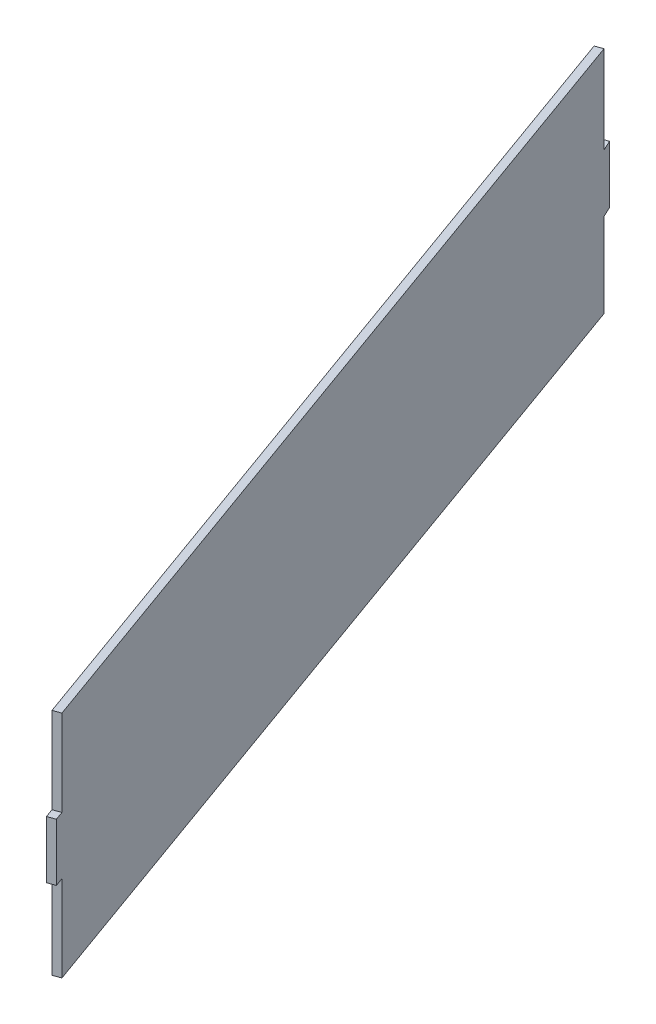
ISO-10303-21;
HEADER;
FILE_DESCRIPTION(('STEP AP214'),'2;1');
FILE_NAME('part.step','',(''),(''),'','','');
FILE_SCHEMA(('AUTOMOTIVE_DESIGN { 1 0 10303 214 1 1 1 1 }'));
ENDSEC;
DATA;
#1=APPLICATION_CONTEXT('core data for automotive mechanical design processes');
#2=APPLICATION_PROTOCOL_DEFINITION('international standard','automotive_design',2000,#1);
#3=PRODUCT_CONTEXT('',#1,'mechanical');
#4=PRODUCT('Part','Part','',(#3));
#5=PRODUCT_RELATED_PRODUCT_CATEGORY('part','',(#4));
#6=PRODUCT_DEFINITION_FORMATION('','',#4);
#7=PRODUCT_DEFINITION_CONTEXT('part definition',#1,'design');
#8=PRODUCT_DEFINITION('design','',#6,#7);
#9=PRODUCT_DEFINITION_SHAPE('','',#8);
#10=(LENGTH_UNIT() NAMED_UNIT(*) SI_UNIT(.MILLI.,.METRE.));
#11=(NAMED_UNIT(*) PLANE_ANGLE_UNIT() SI_UNIT($,.RADIAN.));
#12=(NAMED_UNIT(*) SI_UNIT($,.STERADIAN.) SOLID_ANGLE_UNIT());
#13=UNCERTAINTY_MEASURE_WITH_UNIT(LENGTH_MEASURE(1.E-05),#10,'distance_accuracy_value','');
#14=(GEOMETRIC_REPRESENTATION_CONTEXT(3) GLOBAL_UNCERTAINTY_ASSIGNED_CONTEXT((#13)) GLOBAL_UNIT_ASSIGNED_CONTEXT((#10,
#11,#12)) REPRESENTATION_CONTEXT('',''));
#15=CARTESIAN_POINT('',(0.,0.,0.));
#16=DIRECTION('',(0.,0.,1.));
#17=DIRECTION('',(1.,0.,0.));
#18=AXIS2_PLACEMENT_3D('',#15,#16,#17);
#19=CARTESIAN_POINT('',(237.204386602428,-154.081628831697,2784.44874054199));
#20=DIRECTION('',(0.,1.,0.));
#21=DIRECTION('',(0.,0.,-1.));
#22=AXIS2_PLACEMENT_3D('',#19,#20,#21);
#23=PLANE('',#22);
#24=DIRECTION('',(-0.338341730251732,0.,-0.941023311916482));
#25=VECTOR('',#24,1.);
#26=CARTESIAN_POINT('',(246.7651834515,-154.081628831697,2781.01118856263));
#27=LINE('',#26,#25);
#28=CARTESIAN_POINT('',(250.825284214521,-154.081628831697,2792.30346830563));
#29=VERTEX_POINT('',#28);
#30=CARTESIAN_POINT('',(246.7651834515,-154.081628831697,2781.01118856263));
#31=VERTEX_POINT('',#30);
#32=EDGE_CURVE('E159',#29,#31,#27,.T.);
#33=ORIENTED_EDGE('',*,*,#32,.T.);
#34=DIRECTION('',(0.941023311916483,0.,-0.338341730251728));
#35=VECTOR('',#34,1.);
#36=CARTESIAN_POINT('',(237.204386602428,-154.081628831697,2784.44874054199));
#37=LINE('',#36,#35);
#38=CARTESIAN_POINT('',(237.204386602428,-154.081628831697,2784.44874054199));
#39=VERTEX_POINT('',#38);
#40=EDGE_CURVE('E42',#39,#31,#37,.T.);
#41=ORIENTED_EDGE('',*,*,#40,.F.);
#42=DIRECTION('',(-0.338341730251732,0.,-0.941023311916482));
#43=VECTOR('',#42,1.);
#44=CARTESIAN_POINT('',(237.204386602428,-154.081628831697,2784.44874054199));
#45=LINE('',#44,#43);
#46=CARTESIAN_POINT('',(241.264487365449,-154.081628831697,2795.74102028499));
#47=VERTEX_POINT('',#46);
#48=EDGE_CURVE('E180',#47,#39,#45,.T.);
#49=ORIENTED_EDGE('',*,*,#48,.F.);
#50=DIRECTION('',(0.941023311916483,0.,-0.338341730251728));
#51=VECTOR('',#50,1.);
#52=CARTESIAN_POINT('',(241.264487365449,-154.081628831697,2795.74102028499));
#53=LINE('',#52,#51);
#54=EDGE_CURVE('E11',#47,#29,#53,.T.);
#55=ORIENTED_EDGE('',*,*,#54,.T.);
#56=EDGE_LOOP('',(#33,#41,#49,#55));
#57=FACE_BOUND('',#56,.T.);
#58=ADVANCED_FACE('F39',(#57),#23,.T.);
#59=CARTESIAN_POINT('',(241.264487365449,-154.081628831697,2795.74102028499));
#60=DIRECTION('',(0.338341730251728,0.,0.941023311916483));
#61=DIRECTION('',(-0.941023311916483,0.,0.338341730251728));
#62=AXIS2_PLACEMENT_3D('',#59,#60,#61);
#63=PLANE('',#62);
#64=DIRECTION('',(0.,1.,0.));
#65=VECTOR('',#64,1.);
#66=CARTESIAN_POINT('',(250.825284214521,-154.081628831697,2792.30346830563));
#67=LINE('',#66,#65);
#68=CARTESIAN_POINT('',(250.825284214521,-229.081628831698,2792.30346830563));
#69=VERTEX_POINT('',#68);
#70=EDGE_CURVE('E104',#69,#29,#67,.T.);
#71=ORIENTED_EDGE('',*,*,#70,.T.);
#72=ORIENTED_EDGE('',*,*,#54,.F.);
#73=DIRECTION('',(0.,1.,0.));
#74=VECTOR('',#73,1.);
#75=CARTESIAN_POINT('',(241.264487365449,-154.081628831697,2795.74102028499));
#76=LINE('',#75,#74);
#77=CARTESIAN_POINT('',(241.264487365449,-229.081628831698,2795.74102028499));
#78=VERTEX_POINT('',#77);
#79=EDGE_CURVE('E57',#78,#47,#76,.T.);
#80=ORIENTED_EDGE('',*,*,#79,.F.);
#81=DIRECTION('',(0.941023311916483,0.,-0.338341730251728));
#82=VECTOR('',#81,1.);
#83=CARTESIAN_POINT('',(241.264487365449,-229.081628831698,2795.74102028499));
#84=LINE('',#83,#82);
#85=EDGE_CURVE('E48',#78,#69,#84,.T.);
#86=ORIENTED_EDGE('',*,*,#85,.T.);
#87=EDGE_LOOP('',(#71,#72,#80,#86));
#88=FACE_BOUND('',#87,.T.);
#89=ADVANCED_FACE('F265',(#88),#63,.T.);
#90=CARTESIAN_POINT('',(241.264487365449,-229.081628831698,2795.74102028499));
#91=DIRECTION('',(0.,-1.,0.));
#92=DIRECTION('',(1.,0.,0.));
#93=AXIS2_PLACEMENT_3D('',#90,#91,#92);
#94=PLANE('',#93);
#95=DIRECTION('',(0.338341730251732,0.,0.941023311916482));
#96=VECTOR('',#95,1.);
#97=CARTESIAN_POINT('',(250.825284214521,-229.081628831698,2792.30346830563));
#98=LINE('',#97,#96);
#99=CARTESIAN_POINT('',(246.7651834515,-229.081628831698,2781.01118856263));
#100=VERTEX_POINT('',#99);
#101=EDGE_CURVE('E98',#100,#69,#98,.T.);
#102=ORIENTED_EDGE('',*,*,#101,.T.);
#103=ORIENTED_EDGE('',*,*,#85,.F.);
#104=DIRECTION('',(0.338341730251732,0.,0.941023311916482));
#105=VECTOR('',#104,1.);
#106=CARTESIAN_POINT('',(241.264487365449,-229.081628831698,2795.74102028499));
#107=LINE('',#106,#105);
#108=CARTESIAN_POINT('',(237.204386602428,-229.081628831698,2784.44874054199));
#109=VERTEX_POINT('',#108);
#110=EDGE_CURVE('E141',#109,#78,#107,.T.);
#111=ORIENTED_EDGE('',*,*,#110,.F.);
#112=DIRECTION('',(0.941023311916483,0.,-0.338341730251728));
#113=VECTOR('',#112,1.);
#114=CARTESIAN_POINT('',(237.204386602428,-229.081628831698,2784.44874054199));
#115=LINE('',#114,#113);
#116=EDGE_CURVE('E148',#109,#100,#115,.T.);
#117=ORIENTED_EDGE('',*,*,#116,.T.);
#118=EDGE_LOOP('',(#102,#103,#111,#117));
#119=FACE_BOUND('',#118,.T.);
#120=ADVANCED_FACE('F154',(#119),#94,.T.);
#121=CARTESIAN_POINT('',(237.204386602428,-229.081628831698,2784.44874054199));
#122=DIRECTION('',(0.338341730251728,0.,0.941023311916483));
#123=DIRECTION('',(-0.941023311916483,0.,0.338341730251728));
#124=AXIS2_PLACEMENT_3D('',#121,#122,#123);
#125=PLANE('',#124);
#126=DIRECTION('',(0.,1.,0.));
#127=VECTOR('',#126,1.);
#128=CARTESIAN_POINT('',(246.7651834515,-229.081628831698,2781.01118856263));
#129=LINE('',#128,#127);
#130=CARTESIAN_POINT('',(246.7651834515,-341.581628831697,2781.01118856263));
#131=VERTEX_POINT('',#130);
#132=EDGE_CURVE('E151',#131,#100,#129,.T.);
#133=ORIENTED_EDGE('',*,*,#132,.T.);
#134=ORIENTED_EDGE('',*,*,#116,.F.);
#135=DIRECTION('',(0.,1.,0.));
#136=VECTOR('',#135,1.);
#137=CARTESIAN_POINT('',(237.204386602428,-229.081628831698,2784.44874054199));
#138=LINE('',#137,#136);
#139=CARTESIAN_POINT('',(237.204386602429,-341.581628831697,2784.44874054199));
#140=VERTEX_POINT('',#139);
#141=EDGE_CURVE('E137',#140,#109,#138,.T.);
#142=ORIENTED_EDGE('',*,*,#141,.F.);
#143=DIRECTION('',(0.941023311916483,0.,-0.338341730251728));
#144=VECTOR('',#143,1.);
#145=CARTESIAN_POINT('',(237.204386602429,-341.581628831697,2784.44874054199));
#146=LINE('',#145,#144);
#147=EDGE_CURVE('E152',#140,#131,#146,.T.);
#148=ORIENTED_EDGE('',*,*,#147,.T.);
#149=EDGE_LOOP('',(#133,#134,#142,#148));
#150=FACE_BOUND('',#149,.T.);
#151=ADVANCED_FACE('F149',(#150),#125,.T.);
#152=CARTESIAN_POINT('',(237.204386602429,-341.581628831697,2784.44874054199));
#153=DIRECTION('',(0.,-1.,0.));
#154=DIRECTION('',(1.,0.,0.));
#155=AXIS2_PLACEMENT_3D('',#152,#153,#154);
#156=PLANE('',#155);
#157=DIRECTION('',(0.338341730251728,0.,0.941023311916483));
#158=VECTOR('',#157,1.);
#159=CARTESIAN_POINT('',(246.7651834515,-341.581628831697,2781.01118856263));
#160=LINE('',#159,#158);
#161=CARTESIAN_POINT('',(-151.208280091097,-341.581628831697,1674.13528992874));
#162=VERTEX_POINT('',#161);
#163=EDGE_CURVE('E176',#162,#131,#160,.T.);
#164=ORIENTED_EDGE('',*,*,#163,.T.);
#165=ORIENTED_EDGE('',*,*,#147,.F.);
#166=DIRECTION('',(0.338341730251728,0.,0.941023311916483));
#167=VECTOR('',#166,1.);
#168=CARTESIAN_POINT('',(237.204386602429,-341.581628831697,2784.44874054199));
#169=LINE('',#168,#167);
#170=CARTESIAN_POINT('',(-160.769076940169,-341.581628831697,1677.57284190809));
#171=VERTEX_POINT('',#170);
#172=EDGE_CURVE('E143',#171,#140,#169,.T.);
#173=ORIENTED_EDGE('',*,*,#172,.F.);
#174=DIRECTION('',(0.941023311916483,0.,-0.338341730251728));
#175=VECTOR('',#174,1.);
#176=CARTESIAN_POINT('',(-160.769076940169,-341.581628831697,1677.57284190809));
#177=LINE('',#176,#175);
#178=EDGE_CURVE('E184',#171,#162,#177,.T.);
#179=ORIENTED_EDGE('',*,*,#178,.T.);
#180=EDGE_LOOP('',(#164,#165,#173,#179));
#181=FACE_BOUND('',#180,.T.);
#182=ADVANCED_FACE('F244',(#181),#156,.T.);
#183=CARTESIAN_POINT('',(-160.769076940169,-231.512401326091,1677.57284190809));
#184=DIRECTION('',(-0.338341730251729,0.,-0.941023311916483));
#185=DIRECTION('',(0.941023311916483,0.,-0.338341730251729));
#186=AXIS2_PLACEMENT_3D('',#183,#184,#185);
#187=PLANE('',#186);
#188=DIRECTION('',(0.,-1.,0.));
#189=VECTOR('',#188,1.);
#190=CARTESIAN_POINT('',(-151.208280091097,-231.512401326091,1674.13528992874));
#191=LINE('',#190,#189);
#192=CARTESIAN_POINT('',(-151.208280091097,-231.512401326091,1674.13528992874));
#193=VERTEX_POINT('',#192);
#194=EDGE_CURVE('E174',#193,#162,#191,.T.);
#195=ORIENTED_EDGE('',*,*,#194,.T.);
#196=ORIENTED_EDGE('',*,*,#178,.F.);
#197=DIRECTION('',(0.,-1.,0.));
#198=VECTOR('',#197,1.);
#199=CARTESIAN_POINT('',(-160.769076940169,-231.512401326091,1677.57284190809));
#200=LINE('',#199,#198);
#201=CARTESIAN_POINT('',(-160.769076940169,-231.512401326091,1677.57284190809));
#202=VERTEX_POINT('',#201);
#203=EDGE_CURVE('E234',#202,#171,#200,.T.);
#204=ORIENTED_EDGE('',*,*,#203,.F.);
#205=DIRECTION('',(0.941023311916483,0.,-0.338341730251728));
#206=VECTOR('',#205,1.);
#207=CARTESIAN_POINT('',(-160.769076940169,-231.512401326091,1677.57284190809));
#208=LINE('',#207,#206);
#209=EDGE_CURVE('E187',#202,#193,#208,.T.);
#210=ORIENTED_EDGE('',*,*,#209,.T.);
#211=EDGE_LOOP('',(#195,#196,#204,#210));
#212=FACE_BOUND('',#211,.T.);
#213=ADVANCED_FACE('F240',(#212),#187,.T.);
#214=CARTESIAN_POINT('',(-164.829177703189,-229.081628831698,1666.2805621651));
#215=DIRECTION('',(-0.0671717287604783,-0.980094365221819,-0.186823430317958));
#216=DIRECTION('',(0.,-0.187246339497193,0.982312988993275));
#217=AXIS2_PLACEMENT_3D('',#214,#215,#216);
#218=PLANE('',#217);
#219=DIRECTION('',(0.331606823339121,-0.198532202074224,0.922291645551718));
#220=VECTOR('',#219,1.);
#221=CARTESIAN_POINT('',(-155.268380854118,-229.081628831698,1662.84301018574));
#222=LINE('',#221,#220);
#223=CARTESIAN_POINT('',(-155.268380854118,-229.081628831698,1662.84301018574));
#224=VERTEX_POINT('',#223);
#225=EDGE_CURVE('E172',#224,#193,#222,.T.);
#226=ORIENTED_EDGE('',*,*,#225,.T.);
#227=ORIENTED_EDGE('',*,*,#209,.F.);
#228=DIRECTION('',(0.331606823339121,-0.198532202074224,0.922291645551718));
#229=VECTOR('',#228,1.);
#230=CARTESIAN_POINT('',(-164.829177703189,-229.081628831698,1666.2805621651));
#231=LINE('',#230,#229);
#232=CARTESIAN_POINT('',(-164.829177703189,-229.081628831698,1666.2805621651));
#233=VERTEX_POINT('',#232);
#234=EDGE_CURVE('E232',#233,#202,#231,.T.);
#235=ORIENTED_EDGE('',*,*,#234,.F.);
#236=DIRECTION('',(0.941023311916483,0.,-0.338341730251728));
#237=VECTOR('',#236,1.);
#238=CARTESIAN_POINT('',(-164.829177703189,-229.081628831698,1666.2805621651));
#239=LINE('',#238,#237);
#240=EDGE_CURVE('E190',#233,#224,#239,.T.);
#241=ORIENTED_EDGE('',*,*,#240,.T.);
#242=EDGE_LOOP('',(#226,#227,#235,#241));
#243=FACE_BOUND('',#242,.T.);
#244=ADVANCED_FACE('F248',(#243),#218,.T.);
#245=CARTESIAN_POINT('',(-164.829177703189,-154.081628831698,1666.2805621651));
#246=DIRECTION('',(-0.338341730251728,0.,-0.941023311916483));
#247=DIRECTION('',(0.941023311916483,0.,-0.338341730251728));
#248=AXIS2_PLACEMENT_3D('',#245,#246,#247);
#249=PLANE('',#248);
#250=DIRECTION('',(0.,-1.,0.));
#251=VECTOR('',#250,1.);
#252=CARTESIAN_POINT('',(-155.268380854118,-154.081628831698,1662.84301018574));
#253=LINE('',#252,#251);
#254=CARTESIAN_POINT('',(-155.268380854118,-154.081628831698,1662.84301018574));
#255=VERTEX_POINT('',#254);
#256=EDGE_CURVE('E170',#255,#224,#253,.T.);
#257=ORIENTED_EDGE('',*,*,#256,.T.);
#258=ORIENTED_EDGE('',*,*,#240,.F.);
#259=DIRECTION('',(0.,-1.,0.));
#260=VECTOR('',#259,1.);
#261=CARTESIAN_POINT('',(-164.829177703189,-154.081628831698,1666.2805621651));
#262=LINE('',#261,#260);
#263=CARTESIAN_POINT('',(-164.829177703189,-154.081628831698,1666.2805621651));
#264=VERTEX_POINT('',#263);
#265=EDGE_CURVE('E226',#264,#233,#262,.T.);
#266=ORIENTED_EDGE('',*,*,#265,.F.);
#267=DIRECTION('',(0.941023311916483,0.,-0.338341730251728));
#268=VECTOR('',#267,1.);
#269=CARTESIAN_POINT('',(-164.829177703189,-154.081628831698,1666.2805621651));
#270=LINE('',#269,#268);
#271=EDGE_CURVE('E193',#264,#255,#270,.T.);
#272=ORIENTED_EDGE('',*,*,#271,.T.);
#273=EDGE_LOOP('',(#257,#258,#266,#272));
#274=FACE_BOUND('',#273,.T.);
#275=ADVANCED_FACE('F252',(#274),#249,.T.);
#276=CARTESIAN_POINT('',(-164.829177703189,-154.081628831698,1666.2805621651));
#277=DIRECTION('',(0.060275439719023,0.984003416879627,0.167642914958841));
#278=DIRECTION('',(0.,0.167948281425215,-0.985795807845781));
#279=AXIS2_PLACEMENT_3D('',#276,#277,#278);
#280=PLANE('',#279);
#281=DIRECTION('',(-0.332929418640667,0.17814958762012,-0.925970154289202));
#282=VECTOR('',#281,1.);
#283=CARTESIAN_POINT('',(-155.268380854118,-154.081628831698,1662.84301018574));
#284=LINE('',#283,#282);
#285=CARTESIAN_POINT('',(-151.208280091097,-156.254177234244,1674.13528992874));
#286=VERTEX_POINT('',#285);
#287=EDGE_CURVE('E168',#286,#255,#284,.T.);
#288=ORIENTED_EDGE('',*,*,#287,.T.);
#289=ORIENTED_EDGE('',*,*,#271,.F.);
#290=DIRECTION('',(-0.332929418640667,0.17814958762012,-0.925970154289202));
#291=VECTOR('',#290,1.);
#292=CARTESIAN_POINT('',(-164.829177703189,-154.081628831698,1666.2805621651));
#293=LINE('',#292,#291);
#294=CARTESIAN_POINT('',(-160.769076940169,-156.254177234244,1677.57284190809));
#295=VERTEX_POINT('',#294);
#296=EDGE_CURVE('E223',#295,#264,#293,.T.);
#297=ORIENTED_EDGE('',*,*,#296,.F.);
#298=DIRECTION('',(0.941023311916483,0.,-0.338341730251728));
#299=VECTOR('',#298,1.);
#300=CARTESIAN_POINT('',(-160.769076940169,-156.254177234244,1677.57284190809));
#301=LINE('',#300,#299);
#302=EDGE_CURVE('E196',#295,#286,#301,.T.);
#303=ORIENTED_EDGE('',*,*,#302,.T.);
#304=EDGE_LOOP('',(#288,#289,#297,#303));
#305=FACE_BOUND('',#304,.T.);
#306=ADVANCED_FACE('F255',(#305),#280,.T.);
#307=CARTESIAN_POINT('',(-160.769076940169,-41.581628831698,1677.57284190809));
#308=DIRECTION('',(-0.338341730251729,0.,-0.941023311916483));
#309=DIRECTION('',(0.941023311916483,0.,-0.338341730251729));
#310=AXIS2_PLACEMENT_3D('',#307,#308,#309);
#311=PLANE('',#310);
#312=DIRECTION('',(0.,-1.,0.));
#313=VECTOR('',#312,1.);
#314=CARTESIAN_POINT('',(-151.208280091097,-41.581628831698,1674.13528992874));
#315=LINE('',#314,#313);
#316=CARTESIAN_POINT('',(-151.208280091097,-41.581628831698,1674.13528992874));
#317=VERTEX_POINT('',#316);
#318=EDGE_CURVE('E166',#317,#286,#315,.T.);
#319=ORIENTED_EDGE('',*,*,#318,.T.);
#320=ORIENTED_EDGE('',*,*,#302,.F.);
#321=DIRECTION('',(0.,-1.,0.));
#322=VECTOR('',#321,1.);
#323=CARTESIAN_POINT('',(-160.769076940169,-41.581628831698,1677.57284190809));
#324=LINE('',#323,#322);
#325=CARTESIAN_POINT('',(-160.769076940169,-41.581628831698,1677.57284190809));
#326=VERTEX_POINT('',#325);
#327=EDGE_CURVE('E221',#326,#295,#324,.T.);
#328=ORIENTED_EDGE('',*,*,#327,.F.);
#329=DIRECTION('',(0.941023311916483,0.,-0.338341730251728));
#330=VECTOR('',#329,1.);
#331=CARTESIAN_POINT('',(-160.769076940169,-41.581628831698,1677.57284190809));
#332=LINE('',#331,#330);
#333=EDGE_CURVE('E199',#326,#317,#332,.T.);
#334=ORIENTED_EDGE('',*,*,#333,.T.);
#335=EDGE_LOOP('',(#319,#320,#328,#334));
#336=FACE_BOUND('',#335,.T.);
#337=ADVANCED_FACE('F219',(#336),#311,.T.);
#338=CARTESIAN_POINT('',(237.204386602428,-41.5816288316974,2784.44874054199));
#339=DIRECTION('',(0.,1.,0.));
#340=DIRECTION('',(-1.,0.,0.));
#341=AXIS2_PLACEMENT_3D('',#338,#339,#340);
#342=PLANE('',#341);
#343=DIRECTION('',(-0.338341730251728,0.,-0.941023311916483));
#344=VECTOR('',#343,1.);
#345=CARTESIAN_POINT('',(246.7651834515,-41.5816288316974,2781.01118856263));
#346=LINE('',#345,#344);
#347=CARTESIAN_POINT('',(246.7651834515,-41.5816288316974,2781.01118856263));
#348=VERTEX_POINT('',#347);
#349=EDGE_CURVE('E164',#348,#317,#346,.T.);
#350=ORIENTED_EDGE('',*,*,#349,.T.);
#351=ORIENTED_EDGE('',*,*,#333,.F.);
#352=DIRECTION('',(-0.338341730251728,0.,-0.941023311916483));
#353=VECTOR('',#352,1.);
#354=CARTESIAN_POINT('',(237.204386602428,-41.5816288316974,2784.44874054199));
#355=LINE('',#354,#353);
#356=CARTESIAN_POINT('',(237.204386602428,-41.5816288316974,2784.44874054199));
#357=VERTEX_POINT('',#356);
#358=EDGE_CURVE('E224',#357,#326,#355,.T.);
#359=ORIENTED_EDGE('',*,*,#358,.F.);
#360=DIRECTION('',(0.941023311916483,0.,-0.338341730251728));
#361=VECTOR('',#360,1.);
#362=CARTESIAN_POINT('',(237.204386602428,-41.5816288316974,2784.44874054199));
#363=LINE('',#362,#361);
#364=EDGE_CURVE('E201',#357,#348,#363,.T.);
#365=ORIENTED_EDGE('',*,*,#364,.T.);
#366=EDGE_LOOP('',(#350,#351,#359,#365));
#367=FACE_BOUND('',#366,.T.);
#368=ADVANCED_FACE('F216',(#367),#342,.T.);
#369=CARTESIAN_POINT('',(237.204386602428,-41.5816288316974,2784.44874054199));
#370=DIRECTION('',(0.338341730251728,0.,0.941023311916483));
#371=DIRECTION('',(-0.941023311916483,0.,0.338341730251728));
#372=AXIS2_PLACEMENT_3D('',#369,#370,#371);
#373=PLANE('',#372);
#374=DIRECTION('',(0.,1.,0.));
#375=VECTOR('',#374,1.);
#376=CARTESIAN_POINT('',(246.7651834515,-41.5816288316974,2781.01118856263));
#377=LINE('',#376,#375);
#378=EDGE_CURVE('E162',#31,#348,#377,.T.);
#379=ORIENTED_EDGE('',*,*,#378,.T.);
#380=ORIENTED_EDGE('',*,*,#364,.F.);
#381=DIRECTION('',(0.,1.,0.));
#382=VECTOR('',#381,1.);
#383=CARTESIAN_POINT('',(237.204386602428,-41.5816288316974,2784.44874054199));
#384=LINE('',#383,#382);
#385=EDGE_CURVE('E112',#39,#357,#384,.T.);
#386=ORIENTED_EDGE('',*,*,#385,.F.);
#387=ORIENTED_EDGE('',*,*,#40,.T.);
#388=EDGE_LOOP('',(#379,#380,#386,#387));
#389=FACE_BOUND('',#388,.T.);
#390=ADVANCED_FACE('F207',(#389),#373,.T.);
#391=CARTESIAN_POINT('',(-676.483165184873,0.,243.227220512399));
#392=DIRECTION('',(-0.941023311916482,0.,0.338341730251732));
#393=DIRECTION('',(-0.338341730251732,0.,-0.941023311916482));
#394=AXIS2_PLACEMENT_3D('',#391,#392,#393);
#395=PLANE('',#394);
#396=ORIENTED_EDGE('',*,*,#48,.T.);
#397=ORIENTED_EDGE('',*,*,#385,.T.);
#398=ORIENTED_EDGE('',*,*,#358,.T.);
#399=ORIENTED_EDGE('',*,*,#327,.T.);
#400=ORIENTED_EDGE('',*,*,#296,.T.);
#401=ORIENTED_EDGE('',*,*,#265,.T.);
#402=ORIENTED_EDGE('',*,*,#234,.T.);
#403=ORIENTED_EDGE('',*,*,#203,.T.);
#404=ORIENTED_EDGE('',*,*,#172,.T.);
#405=ORIENTED_EDGE('',*,*,#141,.T.);
#406=ORIENTED_EDGE('',*,*,#110,.T.);
#407=ORIENTED_EDGE('',*,*,#79,.T.);
#408=EDGE_LOOP('',(#396,#397,#398,#399,#400,#401,#402,#403,#404,#405,#406,#407));
#409=FACE_BOUND('',#408,.T.);
#410=ADVANCED_FACE('F139',(#409),#395,.T.);
#411=CARTESIAN_POINT('',(-666.922368335801,0.,239.789668533041));
#412=DIRECTION('',(-0.941023311916482,0.,0.338341730251732));
#413=DIRECTION('',(-0.338341730251732,0.,-0.941023311916482));
#414=AXIS2_PLACEMENT_3D('',#411,#412,#413);
#415=PLANE('',#414);
#416=ORIENTED_EDGE('',*,*,#32,.F.);
#417=ORIENTED_EDGE('',*,*,#70,.F.);
#418=ORIENTED_EDGE('',*,*,#101,.F.);
#419=ORIENTED_EDGE('',*,*,#132,.F.);
#420=ORIENTED_EDGE('',*,*,#163,.F.);
#421=ORIENTED_EDGE('',*,*,#194,.F.);
#422=ORIENTED_EDGE('',*,*,#225,.F.);
#423=ORIENTED_EDGE('',*,*,#256,.F.);
#424=ORIENTED_EDGE('',*,*,#287,.F.);
#425=ORIENTED_EDGE('',*,*,#318,.F.);
#426=ORIENTED_EDGE('',*,*,#349,.F.);
#427=ORIENTED_EDGE('',*,*,#378,.F.);
#428=EDGE_LOOP('',(#416,#417,#418,#419,#420,#421,#422,#423,#424,#425,#426,#427));
#429=FACE_BOUND('',#428,.T.);
#430=ADVANCED_FACE('F212',(#429),#415,.F.);
#431=CLOSED_SHELL('',(#58,#89,#120,#151,#182,#213,#244,#275,#306,#337,#368,#390,#410,#430));
#432=MANIFOLD_SOLID_BREP('B2',#431);
#433=ADVANCED_BREP_SHAPE_REPRESENTATION('',(#18,#432),#14);
#434=SHAPE_DEFINITION_REPRESENTATION(#9,#433);
ENDSEC;
END-ISO-10303-21;
